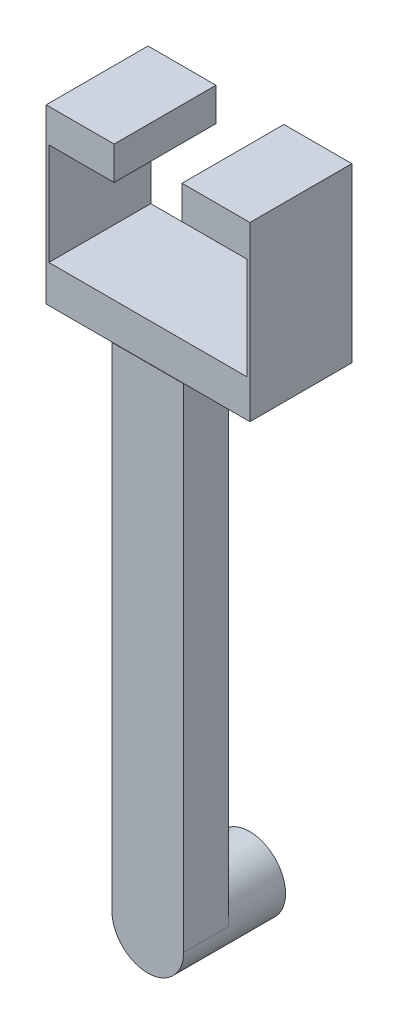
ISO-10303-21;
HEADER;
FILE_DESCRIPTION(('STEP AP214'),'2;1');
FILE_NAME('part.step','',(''),(''),'','','');
FILE_SCHEMA(('AUTOMOTIVE_DESIGN { 1 0 10303 214 1 1 1 1 }'));
ENDSEC;
DATA;
#1=APPLICATION_CONTEXT('core data for automotive mechanical design processes');
#2=APPLICATION_PROTOCOL_DEFINITION('international standard','automotive_design',2000,#1);
#3=PRODUCT_CONTEXT('',#1,'mechanical');
#4=PRODUCT('Part','Part','',(#3));
#5=PRODUCT_RELATED_PRODUCT_CATEGORY('part','',(#4));
#6=PRODUCT_DEFINITION_FORMATION('','',#4);
#7=PRODUCT_DEFINITION_CONTEXT('part definition',#1,'design');
#8=PRODUCT_DEFINITION('design','',#6,#7);
#9=PRODUCT_DEFINITION_SHAPE('','',#8);
#10=(LENGTH_UNIT() NAMED_UNIT(*) SI_UNIT(.MILLI.,.METRE.));
#11=(NAMED_UNIT(*) PLANE_ANGLE_UNIT() SI_UNIT($,.RADIAN.));
#12=(NAMED_UNIT(*) SI_UNIT($,.STERADIAN.) SOLID_ANGLE_UNIT());
#13=UNCERTAINTY_MEASURE_WITH_UNIT(LENGTH_MEASURE(1.E-05),#10,'distance_accuracy_value','');
#14=(GEOMETRIC_REPRESENTATION_CONTEXT(3) GLOBAL_UNCERTAINTY_ASSIGNED_CONTEXT((#13)) GLOBAL_UNIT_ASSIGNED_CONTEXT((#10,
#11,#12)) REPRESENTATION_CONTEXT('',''));
#15=CARTESIAN_POINT('',(0.,0.,0.));
#16=DIRECTION('',(0.,0.,1.));
#17=DIRECTION('',(1.,0.,0.));
#18=AXIS2_PLACEMENT_3D('',#15,#16,#17);
#19=CARTESIAN_POINT('',(0.,0.,38.1));
#20=DIRECTION('',(0.,0.,-1.));
#21=DIRECTION('',(-1.,0.,0.));
#22=AXIS2_PLACEMENT_3D('',#19,#20,#21);
#23=CYLINDRICAL_SURFACE('',#22,13.4112);
#24=CARTESIAN_POINT('',(0.,0.,38.1));
#25=DIRECTION('',(0.,0.,1.));
#26=DIRECTION('',(1.,0.,0.));
#27=AXIS2_PLACEMENT_3D('',#24,#25,#26);
#28=CIRCLE('',#27,13.4112);
#29=CARTESIAN_POINT('',(-13.4112,0.,38.1));
#30=VERTEX_POINT('',#29);
#31=CARTESIAN_POINT('',(13.4112,0.,38.1));
#32=VERTEX_POINT('',#31);
#33=EDGE_CURVE('E540',#30,#32,#28,.T.);
#34=ORIENTED_EDGE('',*,*,#33,.F.);
#35=DIRECTION('',(0.,0.,1.));
#36=VECTOR('',#35,1.);
#37=CARTESIAN_POINT('',(-13.4112,0.,21.3614));
#38=LINE('',#37,#36);
#39=CARTESIAN_POINT('',(-13.4112,0.,21.3614));
#40=VERTEX_POINT('',#39);
#41=EDGE_CURVE('E534',#40,#30,#38,.T.);
#42=ORIENTED_EDGE('',*,*,#41,.F.);
#43=CARTESIAN_POINT('',(0.,0.,21.3614));
#44=DIRECTION('',(0.,0.,-1.));
#45=DIRECTION('',(-1.,0.,0.));
#46=AXIS2_PLACEMENT_3D('',#43,#44,#45);
#47=CIRCLE('',#46,13.4112);
#48=CARTESIAN_POINT('',(13.4112,0.,21.3614));
#49=VERTEX_POINT('',#48);
#50=EDGE_CURVE('E247',#40,#49,#47,.T.);
#51=ORIENTED_EDGE('',*,*,#50,.T.);
#52=DIRECTION('',(0.,0.,1.));
#53=VECTOR('',#52,1.);
#54=CARTESIAN_POINT('',(13.4112,0.,21.3614));
#55=LINE('',#54,#53);
#56=EDGE_CURVE('E529',#49,#32,#55,.T.);
#57=ORIENTED_EDGE('',*,*,#56,.T.);
#58=EDGE_LOOP('',(#34,#42,#51,#57));
#59=FACE_BOUND('',#58,.T.);
#60=CARTESIAN_POINT('',(0.,0.,0.));
#61=DIRECTION('',(0.,0.,1.));
#62=DIRECTION('',(1.,0.,0.));
#63=AXIS2_PLACEMENT_3D('',#60,#61,#62);
#64=CIRCLE('',#63,13.4112);
#65=CARTESIAN_POINT('',(13.4112,0.,0.));
#66=VERTEX_POINT('',#65);
#67=EDGE_CURVE('E523',#66,#66,#64,.T.);
#68=ORIENTED_EDGE('',*,*,#67,.T.);
#69=EDGE_LOOP('',(#68));
#70=FACE_BOUND('',#69,.T.);
#71=ADVANCED_FACE('F246',(#59,#70),#23,.T.);
#72=CARTESIAN_POINT('',(0.,0.,38.1));
#73=DIRECTION('',(0.,0.,1.));
#74=DIRECTION('',(1.,0.,0.));
#75=AXIS2_PLACEMENT_3D('',#72,#73,#74);
#76=PLANE('',#75);
#77=ORIENTED_EDGE('',*,*,#33,.T.);
#78=DIRECTION('',(0.,1.,0.));
#79=VECTOR('',#78,1.);
#80=CARTESIAN_POINT('',(13.4112,0.,38.1));
#81=LINE('',#80,#79);
#82=CARTESIAN_POINT('',(13.4112,184.15,38.1));
#83=VERTEX_POINT('',#82);
#84=EDGE_CURVE('E515',#32,#83,#81,.T.);
#85=ORIENTED_EDGE('',*,*,#84,.T.);
#86=DIRECTION('',(-1.,0.,0.));
#87=VECTOR('',#86,1.);
#88=CARTESIAN_POINT('',(-13.4112,184.15,38.1));
#89=LINE('',#88,#87);
#90=CARTESIAN_POINT('',(-13.4112,184.15,38.1));
#91=VERTEX_POINT('',#90);
#92=EDGE_CURVE('E502',#83,#91,#89,.T.);
#93=ORIENTED_EDGE('',*,*,#92,.T.);
#94=DIRECTION('',(0.,-1.,0.));
#95=VECTOR('',#94,1.);
#96=CARTESIAN_POINT('',(-13.4112,0.,38.1));
#97=LINE('',#96,#95);
#98=EDGE_CURVE('E500',#91,#30,#97,.T.);
#99=ORIENTED_EDGE('',*,*,#98,.T.);
#100=EDGE_LOOP('',(#77,#85,#93,#99));
#101=FACE_BOUND('',#100,.T.);
#102=ADVANCED_FACE('F548',(#101),#76,.T.);
#103=CARTESIAN_POINT('',(0.,0.,0.));
#104=DIRECTION('',(0.,0.,1.));
#105=DIRECTION('',(1.,0.,0.));
#106=AXIS2_PLACEMENT_3D('',#103,#104,#105);
#107=PLANE('',#106);
#108=ORIENTED_EDGE('',*,*,#67,.F.);
#109=EDGE_LOOP('',(#108));
#110=FACE_BOUND('',#109,.T.);
#111=ADVANCED_FACE('F546',(#110),#107,.F.);
#112=CARTESIAN_POINT('',(-13.4112,0.,21.3614));
#113=DIRECTION('',(-1.,0.,0.));
#114=DIRECTION('',(0.,0.,1.));
#115=AXIS2_PLACEMENT_3D('',#112,#113,#114);
#116=PLANE('',#115);
#117=ORIENTED_EDGE('',*,*,#98,.F.);
#118=DIRECTION('',(0.,0.,1.));
#119=VECTOR('',#118,1.);
#120=CARTESIAN_POINT('',(-13.4112,184.15,21.3614));
#121=LINE('',#120,#119);
#122=CARTESIAN_POINT('',(-13.4112,184.15,37.9982149944373));
#123=VERTEX_POINT('',#122);
#124=EDGE_CURVE('E522',#123,#91,#121,.T.);
#125=ORIENTED_EDGE('',*,*,#124,.F.);
#126=CARTESIAN_POINT('',(-13.4112,184.15,21.3614));
#127=VERTEX_POINT('',#126);
#128=EDGE_CURVE('E516',#127,#123,#121,.T.);
#129=ORIENTED_EDGE('',*,*,#128,.F.);
#130=DIRECTION('',(0.,-1.,0.));
#131=VECTOR('',#130,1.);
#132=CARTESIAN_POINT('',(-13.4112,0.,21.3614));
#133=LINE('',#132,#131);
#134=EDGE_CURVE('E499',#127,#40,#133,.T.);
#135=ORIENTED_EDGE('',*,*,#134,.T.);
#136=ORIENTED_EDGE('',*,*,#41,.T.);
#137=EDGE_LOOP('',(#117,#125,#129,#135,#136));
#138=FACE_BOUND('',#137,.T.);
#139=ADVANCED_FACE('F547',(#138),#116,.T.);
#140=CARTESIAN_POINT('',(-13.4112,184.15,21.3614));
#141=DIRECTION('',(0.,1.,0.));
#142=DIRECTION('',(0.,0.,1.));
#143=AXIS2_PLACEMENT_3D('',#140,#141,#142);
#144=PLANE('',#143);
#145=DIRECTION('',(1.,0.,0.));
#146=VECTOR('',#145,1.);
#147=CARTESIAN_POINT('',(-38.1,184.15,37.9982149944373));
#148=LINE('',#147,#146);
#149=CARTESIAN_POINT('',(13.4112,184.15,37.9982149944373));
#150=VERTEX_POINT('',#149);
#151=EDGE_CURVE('E13',#123,#150,#148,.T.);
#152=ORIENTED_EDGE('',*,*,#151,.F.);
#153=ORIENTED_EDGE('',*,*,#124,.T.);
#154=ORIENTED_EDGE('',*,*,#92,.F.);
#155=DIRECTION('',(0.,0.,1.));
#156=VECTOR('',#155,1.);
#157=CARTESIAN_POINT('',(13.4112,184.15,21.3614));
#158=LINE('',#157,#156);
#159=EDGE_CURVE('E530',#150,#83,#158,.T.);
#160=ORIENTED_EDGE('',*,*,#159,.F.);
#161=EDGE_LOOP('',(#152,#153,#154,#160));
#162=FACE_BOUND('',#161,.T.);
#163=ADVANCED_FACE('F551',(#162),#144,.T.);
#164=CARTESIAN_POINT('',(13.4112,0.,21.3614));
#165=DIRECTION('',(1.,0.,0.));
#166=DIRECTION('',(0.,0.,-1.));
#167=AXIS2_PLACEMENT_3D('',#164,#165,#166);
#168=PLANE('',#167);
#169=ORIENTED_EDGE('',*,*,#84,.F.);
#170=ORIENTED_EDGE('',*,*,#56,.F.);
#171=DIRECTION('',(0.,1.,0.));
#172=VECTOR('',#171,1.);
#173=CARTESIAN_POINT('',(13.4112,0.,21.3614));
#174=LINE('',#173,#172);
#175=CARTESIAN_POINT('',(13.4112,184.15,21.3614));
#176=VERTEX_POINT('',#175);
#177=EDGE_CURVE('E504',#49,#176,#174,.T.);
#178=ORIENTED_EDGE('',*,*,#177,.T.);
#179=EDGE_CURVE('E528',#176,#150,#158,.T.);
#180=ORIENTED_EDGE('',*,*,#179,.T.);
#181=ORIENTED_EDGE('',*,*,#159,.T.);
#182=EDGE_LOOP('',(#169,#170,#178,#180,#181));
#183=FACE_BOUND('',#182,.T.);
#184=ADVANCED_FACE('F705',(#183),#168,.T.);
#185=CARTESIAN_POINT('',(0.,0.,21.3614));
#186=DIRECTION('',(0.,0.,-1.));
#187=DIRECTION('',(-1.,0.,0.));
#188=AXIS2_PLACEMENT_3D('',#185,#186,#187);
#189=PLANE('',#188);
#190=ORIENTED_EDGE('',*,*,#50,.F.);
#191=ORIENTED_EDGE('',*,*,#134,.F.);
#192=DIRECTION('',(-1.,0.,0.));
#193=VECTOR('',#192,1.);
#194=CARTESIAN_POINT('',(-13.4112,184.15,21.3614));
#195=LINE('',#194,#193);
#196=EDGE_CURVE('E510',#176,#127,#195,.T.);
#197=ORIENTED_EDGE('',*,*,#196,.F.);
#198=ORIENTED_EDGE('',*,*,#177,.F.);
#199=EDGE_LOOP('',(#190,#191,#197,#198));
#200=FACE_BOUND('',#199,.T.);
#201=ADVANCED_FACE('F698',(#200),#189,.T.);
#202=CARTESIAN_POINT('',(38.1,198.12,-0.101785005562682));
#203=DIRECTION('',(-1.,0.,0.));
#204=DIRECTION('',(0.,0.,1.));
#205=AXIS2_PLACEMENT_3D('',#202,#203,#204);
#206=PLANE('',#205);
#207=DIRECTION('',(0.,0.,-1.));
#208=VECTOR('',#207,1.);
#209=CARTESIAN_POINT('',(38.1,184.15,-0.101785005562682));
#210=LINE('',#209,#208);
#211=CARTESIAN_POINT('',(38.1,184.15,37.9982149944373));
#212=VERTEX_POINT('',#211);
#213=CARTESIAN_POINT('',(38.1,184.15,-0.101785005562682));
#214=VERTEX_POINT('',#213);
#215=EDGE_CURVE('E456',#212,#214,#210,.T.);
#216=ORIENTED_EDGE('',*,*,#215,.T.);
#217=DIRECTION('',(0.,-1.,0.));
#218=VECTOR('',#217,1.);
#219=CARTESIAN_POINT('',(38.1,198.12,-0.101785005562682));
#220=LINE('',#219,#218);
#221=CARTESIAN_POINT('',(38.1,248.666,-0.101785005562682));
#222=VERTEX_POINT('',#221);
#223=EDGE_CURVE('E492',#222,#214,#220,.T.);
#224=ORIENTED_EDGE('',*,*,#223,.F.);
#225=DIRECTION('',(0.,0.,-1.));
#226=VECTOR('',#225,1.);
#227=CARTESIAN_POINT('',(38.1,248.666,-0.101785005562682));
#228=LINE('',#227,#226);
#229=CARTESIAN_POINT('',(38.1,248.666,37.9982149944373));
#230=VERTEX_POINT('',#229);
#231=EDGE_CURVE('E439',#230,#222,#228,.T.);
#232=ORIENTED_EDGE('',*,*,#231,.F.);
#233=DIRECTION('',(0.,-1.,0.));
#234=VECTOR('',#233,1.);
#235=CARTESIAN_POINT('',(38.1,198.12,37.9982149944373));
#236=LINE('',#235,#234);
#237=EDGE_CURVE('E381',#230,#212,#236,.T.);
#238=ORIENTED_EDGE('',*,*,#237,.T.);
#239=EDGE_LOOP('',(#216,#224,#232,#238));
#240=FACE_BOUND('',#239,.T.);
#241=ADVANCED_FACE('F681',(#240),#206,.F.);
#242=CARTESIAN_POINT('',(-38.1,198.12,-0.101785005562682));
#243=DIRECTION('',(0.,0.,1.));
#244=DIRECTION('',(1.,0.,0.));
#245=AXIS2_PLACEMENT_3D('',#242,#243,#244);
#246=PLANE('',#245);
#247=DIRECTION('',(-1.,0.,0.));
#248=VECTOR('',#247,1.);
#249=CARTESIAN_POINT('',(-38.1,184.15,-0.101785005562682));
#250=LINE('',#249,#248);
#251=CARTESIAN_POINT('',(-38.1,184.15,-0.101785005562682));
#252=VERTEX_POINT('',#251);
#253=EDGE_CURVE('E485',#214,#252,#250,.T.);
#254=ORIENTED_EDGE('',*,*,#253,.T.);
#255=DIRECTION('',(0.,-1.,0.));
#256=VECTOR('',#255,1.);
#257=CARTESIAN_POINT('',(-38.1,198.12,-0.101785005562682));
#258=LINE('',#257,#256);
#259=CARTESIAN_POINT('',(-38.1,248.666,-0.101785005562682));
#260=VERTEX_POINT('',#259);
#261=EDGE_CURVE('E379',#260,#252,#258,.T.);
#262=ORIENTED_EDGE('',*,*,#261,.F.);
#263=DIRECTION('',(-1.,0.,0.));
#264=VECTOR('',#263,1.);
#265=CARTESIAN_POINT('',(-38.1,248.666,-0.101785005562682));
#266=LINE('',#265,#264);
#267=CARTESIAN_POINT('',(-12.7,248.666,-0.101785005562682));
#268=VERTEX_POINT('',#267);
#269=EDGE_CURVE('E396',#268,#260,#266,.T.);
#270=ORIENTED_EDGE('',*,*,#269,.F.);
#271=DIRECTION('',(0.,-1.,0.));
#272=VECTOR('',#271,1.);
#273=CARTESIAN_POINT('',(-12.7,248.666,-0.101785005562682));
#274=LINE('',#273,#272);
#275=CARTESIAN_POINT('',(-12.7,236.22,-0.101785005562682));
#276=VERTEX_POINT('',#275);
#277=EDGE_CURVE('E620',#268,#276,#274,.T.);
#278=ORIENTED_EDGE('',*,*,#277,.T.);
#279=DIRECTION('',(-1.,0.,0.));
#280=VECTOR('',#279,1.);
#281=CARTESIAN_POINT('',(-38.1,236.22,-0.101785005562682));
#282=LINE('',#281,#280);
#283=CARTESIAN_POINT('',(-37.084,236.22,-0.101785005562682));
#284=VERTEX_POINT('',#283);
#285=EDGE_CURVE('E397',#276,#284,#282,.T.);
#286=ORIENTED_EDGE('',*,*,#285,.T.);
#287=DIRECTION('',(0.,-1.,0.));
#288=VECTOR('',#287,1.);
#289=CARTESIAN_POINT('',(-37.084,236.22,-0.101785005562682));
#290=LINE('',#289,#288);
#291=CARTESIAN_POINT('',(-37.084,198.12,-0.101785005562682));
#292=VERTEX_POINT('',#291);
#293=EDGE_CURVE('E447',#284,#292,#290,.T.);
#294=ORIENTED_EDGE('',*,*,#293,.T.);
#295=DIRECTION('',(-1.,0.,0.));
#296=VECTOR('',#295,1.);
#297=CARTESIAN_POINT('',(-38.1,198.12,-0.101785005562682));
#298=LINE('',#297,#296);
#299=CARTESIAN_POINT('',(37.084,198.12,-0.101785005562682));
#300=VERTEX_POINT('',#299);
#301=EDGE_CURVE('E471',#300,#292,#298,.T.);
#302=ORIENTED_EDGE('',*,*,#301,.F.);
#303=DIRECTION('',(0.,-1.,0.));
#304=VECTOR('',#303,1.);
#305=CARTESIAN_POINT('',(37.084,236.22,-0.101785005562682));
#306=LINE('',#305,#304);
#307=CARTESIAN_POINT('',(37.084,236.22,-0.101785005562682));
#308=VERTEX_POINT('',#307);
#309=EDGE_CURVE('E459',#308,#300,#306,.T.);
#310=ORIENTED_EDGE('',*,*,#309,.F.);
#311=DIRECTION('',(-1.,0.,0.));
#312=VECTOR('',#311,1.);
#313=CARTESIAN_POINT('',(38.1,236.22,-0.101785005562682));
#314=LINE('',#313,#312);
#315=CARTESIAN_POINT('',(12.7,236.22,-0.101785005562679));
#316=VERTEX_POINT('',#315);
#317=EDGE_CURVE('E425',#308,#316,#314,.T.);
#318=ORIENTED_EDGE('',*,*,#317,.T.);
#319=DIRECTION('',(0.,-1.,0.));
#320=VECTOR('',#319,1.);
#321=CARTESIAN_POINT('',(12.7,248.666,-0.101785005562679));
#322=LINE('',#321,#320);
#323=CARTESIAN_POINT('',(12.7,248.666,-0.101785005562679));
#324=VERTEX_POINT('',#323);
#325=EDGE_CURVE('E665',#324,#316,#322,.T.);
#326=ORIENTED_EDGE('',*,*,#325,.F.);
#327=DIRECTION('',(-1.,0.,0.));
#328=VECTOR('',#327,1.);
#329=CARTESIAN_POINT('',(38.1,248.666,-0.101785005562682));
#330=LINE('',#329,#328);
#331=EDGE_CURVE('E440',#222,#324,#330,.T.);
#332=ORIENTED_EDGE('',*,*,#331,.F.);
#333=ORIENTED_EDGE('',*,*,#223,.T.);
#334=EDGE_LOOP('',(#254,#262,#270,#278,#286,#294,#302,#310,#318,#326,#332,#333));
#335=FACE_BOUND('',#334,.T.);
#336=ADVANCED_FACE('F686',(#335),#246,.F.);
#337=CARTESIAN_POINT('',(-38.1,198.12,-0.101785005562682));
#338=DIRECTION('',(1.,0.,0.));
#339=DIRECTION('',(0.,0.,-1.));
#340=AXIS2_PLACEMENT_3D('',#337,#338,#339);
#341=PLANE('',#340);
#342=DIRECTION('',(0.,0.,1.));
#343=VECTOR('',#342,1.);
#344=CARTESIAN_POINT('',(-38.1,184.15,-0.101785005562682));
#345=LINE('',#344,#343);
#346=CARTESIAN_POINT('',(-38.1,184.15,37.9982149944373));
#347=VERTEX_POINT('',#346);
#348=EDGE_CURVE('E374',#252,#347,#345,.T.);
#349=ORIENTED_EDGE('',*,*,#348,.T.);
#350=DIRECTION('',(0.,-1.,0.));
#351=VECTOR('',#350,1.);
#352=CARTESIAN_POINT('',(-38.1,198.12,37.9982149944373));
#353=LINE('',#352,#351);
#354=CARTESIAN_POINT('',(-38.1,248.666,37.9982149944373));
#355=VERTEX_POINT('',#354);
#356=EDGE_CURVE('E366',#355,#347,#353,.T.);
#357=ORIENTED_EDGE('',*,*,#356,.F.);
#358=DIRECTION('',(0.,0.,1.));
#359=VECTOR('',#358,1.);
#360=CARTESIAN_POINT('',(-38.1,248.666,-0.101785005562682));
#361=LINE('',#360,#359);
#362=EDGE_CURVE('E373',#260,#355,#361,.T.);
#363=ORIENTED_EDGE('',*,*,#362,.F.);
#364=ORIENTED_EDGE('',*,*,#261,.T.);
#365=EDGE_LOOP('',(#349,#357,#363,#364));
#366=FACE_BOUND('',#365,.T.);
#367=ADVANCED_FACE('F367',(#366),#341,.F.);
#368=CARTESIAN_POINT('',(-38.1,198.12,37.9982149944373));
#369=DIRECTION('',(0.,0.,-1.));
#370=DIRECTION('',(-1.,0.,0.));
#371=AXIS2_PLACEMENT_3D('',#368,#369,#370);
#372=PLANE('',#371);
#373=EDGE_CURVE('E260',#347,#123,#148,.T.);
#374=ORIENTED_EDGE('',*,*,#373,.T.);
#375=ORIENTED_EDGE('',*,*,#151,.T.);
#376=EDGE_CURVE('E256',#150,#212,#148,.T.);
#377=ORIENTED_EDGE('',*,*,#376,.T.);
#378=ORIENTED_EDGE('',*,*,#237,.F.);
#379=DIRECTION('',(1.,0.,0.));
#380=VECTOR('',#379,1.);
#381=CARTESIAN_POINT('',(38.1,248.666,37.9982149944373));
#382=LINE('',#381,#380);
#383=CARTESIAN_POINT('',(12.7,248.666,37.9982149944373));
#384=VERTEX_POINT('',#383);
#385=EDGE_CURVE('E427',#384,#230,#382,.T.);
#386=ORIENTED_EDGE('',*,*,#385,.F.);
#387=DIRECTION('',(0.,-1.,0.));
#388=VECTOR('',#387,1.);
#389=CARTESIAN_POINT('',(12.7,248.666,37.9982149944373));
#390=LINE('',#389,#388);
#391=CARTESIAN_POINT('',(12.7,236.22,37.9982149944373));
#392=VERTEX_POINT('',#391);
#393=EDGE_CURVE('E432',#384,#392,#390,.T.);
#394=ORIENTED_EDGE('',*,*,#393,.T.);
#395=DIRECTION('',(1.,0.,0.));
#396=VECTOR('',#395,1.);
#397=CARTESIAN_POINT('',(38.1,236.22,37.9982149944373));
#398=LINE('',#397,#396);
#399=CARTESIAN_POINT('',(37.084,236.22,37.9982149944373));
#400=VERTEX_POINT('',#399);
#401=EDGE_CURVE('E421',#392,#400,#398,.T.);
#402=ORIENTED_EDGE('',*,*,#401,.T.);
#403=DIRECTION('',(0.,-1.,0.));
#404=VECTOR('',#403,1.);
#405=CARTESIAN_POINT('',(37.084,236.22,37.9982149944373));
#406=LINE('',#405,#404);
#407=CARTESIAN_POINT('',(37.084,198.12,37.9982149944373));
#408=VERTEX_POINT('',#407);
#409=EDGE_CURVE('E462',#400,#408,#406,.T.);
#410=ORIENTED_EDGE('',*,*,#409,.T.);
#411=DIRECTION('',(1.,0.,0.));
#412=VECTOR('',#411,1.);
#413=CARTESIAN_POINT('',(-38.1,198.12,37.9982149944373));
#414=LINE('',#413,#412);
#415=CARTESIAN_POINT('',(-37.084,198.12,37.9982149944373));
#416=VERTEX_POINT('',#415);
#417=EDGE_CURVE('E474',#416,#408,#414,.T.);
#418=ORIENTED_EDGE('',*,*,#417,.F.);
#419=DIRECTION('',(0.,-1.,0.));
#420=VECTOR('',#419,1.);
#421=CARTESIAN_POINT('',(-37.084,236.22,37.9982149944373));
#422=LINE('',#421,#420);
#423=CARTESIAN_POINT('',(-37.084,236.22,37.9982149944373));
#424=VERTEX_POINT('',#423);
#425=EDGE_CURVE('E453',#424,#416,#422,.T.);
#426=ORIENTED_EDGE('',*,*,#425,.F.);
#427=DIRECTION('',(1.,0.,0.));
#428=VECTOR('',#427,1.);
#429=CARTESIAN_POINT('',(-38.1,236.22,37.9982149944373));
#430=LINE('',#429,#428);
#431=CARTESIAN_POINT('',(-12.7,236.22,37.9982149944373));
#432=VERTEX_POINT('',#431);
#433=EDGE_CURVE('E428',#424,#432,#430,.T.);
#434=ORIENTED_EDGE('',*,*,#433,.T.);
#435=DIRECTION('',(0.,-1.,0.));
#436=VECTOR('',#435,1.);
#437=CARTESIAN_POINT('',(-12.7,248.666,37.9982149944373));
#438=LINE('',#437,#436);
#439=CARTESIAN_POINT('',(-12.7,248.666,37.9982149944373));
#440=VERTEX_POINT('',#439);
#441=EDGE_CURVE('E390',#440,#432,#438,.T.);
#442=ORIENTED_EDGE('',*,*,#441,.F.);
#443=DIRECTION('',(1.,0.,0.));
#444=VECTOR('',#443,1.);
#445=CARTESIAN_POINT('',(-38.1,248.666,37.9982149944373));
#446=LINE('',#445,#444);
#447=EDGE_CURVE('E383',#355,#440,#446,.T.);
#448=ORIENTED_EDGE('',*,*,#447,.F.);
#449=ORIENTED_EDGE('',*,*,#356,.T.);
#450=EDGE_LOOP('',(#374,#375,#377,#378,#386,#394,#402,#410,#418,#426,#434,#442,#448,#449));
#451=FACE_BOUND('',#450,.T.);
#452=ADVANCED_FACE('F384',(#451),#372,.F.);
#453=CARTESIAN_POINT('',(0.,198.12,0.));
#454=DIRECTION('',(0.,1.,0.));
#455=DIRECTION('',(0.,0.,1.));
#456=AXIS2_PLACEMENT_3D('',#453,#454,#455);
#457=PLANE('',#456);
#458=DIRECTION('',(0.,0.,-1.));
#459=VECTOR('',#458,1.);
#460=CARTESIAN_POINT('',(-37.084,198.12,-0.101785005562682));
#461=LINE('',#460,#459);
#462=EDGE_CURVE('E264',#416,#292,#461,.T.);
#463=ORIENTED_EDGE('',*,*,#462,.F.);
#464=ORIENTED_EDGE('',*,*,#417,.T.);
#465=DIRECTION('',(0.,0.,1.));
#466=VECTOR('',#465,1.);
#467=CARTESIAN_POINT('',(37.084,198.12,-0.101785005562682));
#468=LINE('',#467,#466);
#469=EDGE_CURVE('E269',#300,#408,#468,.T.);
#470=ORIENTED_EDGE('',*,*,#469,.F.);
#471=ORIENTED_EDGE('',*,*,#301,.T.);
#472=EDGE_LOOP('',(#463,#464,#470,#471));
#473=FACE_BOUND('',#472,.T.);
#474=ADVANCED_FACE('F755',(#473),#457,.T.);
#475=CARTESIAN_POINT('',(0.,184.15,0.));
#476=DIRECTION('',(0.,1.,0.));
#477=DIRECTION('',(0.,0.,1.));
#478=AXIS2_PLACEMENT_3D('',#475,#476,#477);
#479=PLANE('',#478);
#480=ORIENTED_EDGE('',*,*,#179,.F.);
#481=ORIENTED_EDGE('',*,*,#196,.T.);
#482=ORIENTED_EDGE('',*,*,#128,.T.);
#483=ORIENTED_EDGE('',*,*,#373,.F.);
#484=ORIENTED_EDGE('',*,*,#348,.F.);
#485=ORIENTED_EDGE('',*,*,#253,.F.);
#486=ORIENTED_EDGE('',*,*,#215,.F.);
#487=ORIENTED_EDGE('',*,*,#376,.F.);
#488=EDGE_LOOP('',(#480,#481,#482,#483,#484,#485,#486,#487));
#489=FACE_BOUND('',#488,.T.);
#490=ADVANCED_FACE('F738',(#489),#479,.F.);
#491=CARTESIAN_POINT('',(37.084,236.22,-0.101785005562682));
#492=DIRECTION('',(1.,0.,0.));
#493=DIRECTION('',(0.,0.,-1.));
#494=AXIS2_PLACEMENT_3D('',#491,#492,#493);
#495=PLANE('',#494);
#496=ORIENTED_EDGE('',*,*,#469,.T.);
#497=ORIENTED_EDGE('',*,*,#409,.F.);
#498=DIRECTION('',(0.,0.,1.));
#499=VECTOR('',#498,1.);
#500=CARTESIAN_POINT('',(37.084,236.22,-0.101785005562682));
#501=LINE('',#500,#499);
#502=EDGE_CURVE('E466',#308,#400,#501,.T.);
#503=ORIENTED_EDGE('',*,*,#502,.F.);
#504=ORIENTED_EDGE('',*,*,#309,.T.);
#505=EDGE_LOOP('',(#496,#497,#503,#504));
#506=FACE_BOUND('',#505,.T.);
#507=ADVANCED_FACE('F753',(#506),#495,.F.);
#508=CARTESIAN_POINT('',(-37.084,236.22,-0.101785005562682));
#509=DIRECTION('',(-1.,0.,0.));
#510=DIRECTION('',(0.,0.,1.));
#511=AXIS2_PLACEMENT_3D('',#508,#509,#510);
#512=PLANE('',#511);
#513=ORIENTED_EDGE('',*,*,#462,.T.);
#514=ORIENTED_EDGE('',*,*,#293,.F.);
#515=DIRECTION('',(0.,0.,-1.));
#516=VECTOR('',#515,1.);
#517=CARTESIAN_POINT('',(-37.084,236.22,-0.101785005562682));
#518=LINE('',#517,#516);
#519=EDGE_CURVE('E444',#424,#284,#518,.T.);
#520=ORIENTED_EDGE('',*,*,#519,.F.);
#521=ORIENTED_EDGE('',*,*,#425,.T.);
#522=EDGE_LOOP('',(#513,#514,#520,#521));
#523=FACE_BOUND('',#522,.T.);
#524=ADVANCED_FACE('F756',(#523),#512,.F.);
#525=CARTESIAN_POINT('',(0.,236.22,0.));
#526=DIRECTION('',(0.,1.,0.));
#527=DIRECTION('',(0.,0.,1.));
#528=AXIS2_PLACEMENT_3D('',#525,#526,#527);
#529=PLANE('',#528);
#530=ORIENTED_EDGE('',*,*,#433,.F.);
#531=ORIENTED_EDGE('',*,*,#519,.T.);
#532=ORIENTED_EDGE('',*,*,#285,.F.);
#533=DIRECTION('',(0.,0.,-1.));
#534=VECTOR('',#533,1.);
#535=CARTESIAN_POINT('',(-12.7,236.22,-0.101785005562682));
#536=LINE('',#535,#534);
#537=EDGE_CURVE('E401',#432,#276,#536,.T.);
#538=ORIENTED_EDGE('',*,*,#537,.F.);
#539=EDGE_LOOP('',(#530,#531,#532,#538));
#540=FACE_BOUND('',#539,.T.);
#541=ADVANCED_FACE('F766',(#540),#529,.F.);
#542=CARTESIAN_POINT('',(-12.7,248.666,-0.101785005562682));
#543=DIRECTION('',(-1.,0.,0.));
#544=DIRECTION('',(0.,0.,1.));
#545=AXIS2_PLACEMENT_3D('',#542,#543,#544);
#546=PLANE('',#545);
#547=ORIENTED_EDGE('',*,*,#537,.T.);
#548=ORIENTED_EDGE('',*,*,#277,.F.);
#549=DIRECTION('',(0.,0.,-1.));
#550=VECTOR('',#549,1.);
#551=CARTESIAN_POINT('',(-12.7,248.666,-0.101785005562682));
#552=LINE('',#551,#550);
#553=EDGE_CURVE('E393',#440,#268,#552,.T.);
#554=ORIENTED_EDGE('',*,*,#553,.F.);
#555=ORIENTED_EDGE('',*,*,#441,.T.);
#556=EDGE_LOOP('',(#547,#548,#554,#555));
#557=FACE_BOUND('',#556,.T.);
#558=ADVANCED_FACE('F796',(#557),#546,.F.);
#559=CARTESIAN_POINT('',(0.,248.666,0.));
#560=DIRECTION('',(0.,1.,0.));
#561=DIRECTION('',(0.,0.,1.));
#562=AXIS2_PLACEMENT_3D('',#559,#560,#561);
#563=PLANE('',#562);
#564=ORIENTED_EDGE('',*,*,#362,.T.);
#565=ORIENTED_EDGE('',*,*,#447,.T.);
#566=ORIENTED_EDGE('',*,*,#553,.T.);
#567=ORIENTED_EDGE('',*,*,#269,.T.);
#568=EDGE_LOOP('',(#564,#565,#566,#567));
#569=FACE_BOUND('',#568,.T.);
#570=ADVANCED_FACE('F395',(#569),#563,.T.);
#571=CARTESIAN_POINT('',(12.7,248.666,-0.101785005562679));
#572=DIRECTION('',(1.,0.,0.));
#573=DIRECTION('',(0.,0.,-1.));
#574=AXIS2_PLACEMENT_3D('',#571,#572,#573);
#575=PLANE('',#574);
#576=DIRECTION('',(0.,0.,1.));
#577=VECTOR('',#576,1.);
#578=CARTESIAN_POINT('',(12.7,236.22,-0.101785005562679));
#579=LINE('',#578,#577);
#580=EDGE_CURVE('E417',#316,#392,#579,.T.);
#581=ORIENTED_EDGE('',*,*,#580,.T.);
#582=ORIENTED_EDGE('',*,*,#393,.F.);
#583=DIRECTION('',(0.,0.,1.));
#584=VECTOR('',#583,1.);
#585=CARTESIAN_POINT('',(12.7,248.666,-0.101785005562679));
#586=LINE('',#585,#584);
#587=EDGE_CURVE('E433',#324,#384,#586,.T.);
#588=ORIENTED_EDGE('',*,*,#587,.F.);
#589=ORIENTED_EDGE('',*,*,#325,.T.);
#590=EDGE_LOOP('',(#581,#582,#588,#589));
#591=FACE_BOUND('',#590,.T.);
#592=ADVANCED_FACE('F671',(#591),#575,.F.);
#593=CARTESIAN_POINT('',(0.,248.666,0.));
#594=DIRECTION('',(0.,-1.,0.));
#595=DIRECTION('',(0.,0.,-1.));
#596=AXIS2_PLACEMENT_3D('',#593,#594,#595);
#597=PLANE('',#596);
#598=ORIENTED_EDGE('',*,*,#231,.T.);
#599=ORIENTED_EDGE('',*,*,#331,.T.);
#600=ORIENTED_EDGE('',*,*,#587,.T.);
#601=ORIENTED_EDGE('',*,*,#385,.T.);
#602=EDGE_LOOP('',(#598,#599,#600,#601));
#603=FACE_BOUND('',#602,.T.);
#604=ADVANCED_FACE('F682',(#603),#597,.F.);
#605=CARTESIAN_POINT('',(0.,236.22,0.));
#606=DIRECTION('',(0.,-1.,0.));
#607=DIRECTION('',(0.,0.,-1.));
#608=AXIS2_PLACEMENT_3D('',#605,#606,#607);
#609=PLANE('',#608);
#610=ORIENTED_EDGE('',*,*,#317,.F.);
#611=ORIENTED_EDGE('',*,*,#502,.T.);
#612=ORIENTED_EDGE('',*,*,#401,.F.);
#613=ORIENTED_EDGE('',*,*,#580,.F.);
#614=EDGE_LOOP('',(#610,#611,#612,#613));
#615=FACE_BOUND('',#614,.T.);
#616=ADVANCED_FACE('F676',(#615),#609,.T.);
#617=CLOSED_SHELL('',(#71,#102,#111,#139,#163,#184,#201,#241,#336,#367,#452,#474,#490,#507,#524,
#541,#558,#570,#592,#604,#616));
#618=MANIFOLD_SOLID_BREP('B2',#617);
#619=ADVANCED_BREP_SHAPE_REPRESENTATION('',(#18,#618),#14);
#620=SHAPE_DEFINITION_REPRESENTATION(#9,#619);
ENDSEC;
END-ISO-10303-21;
